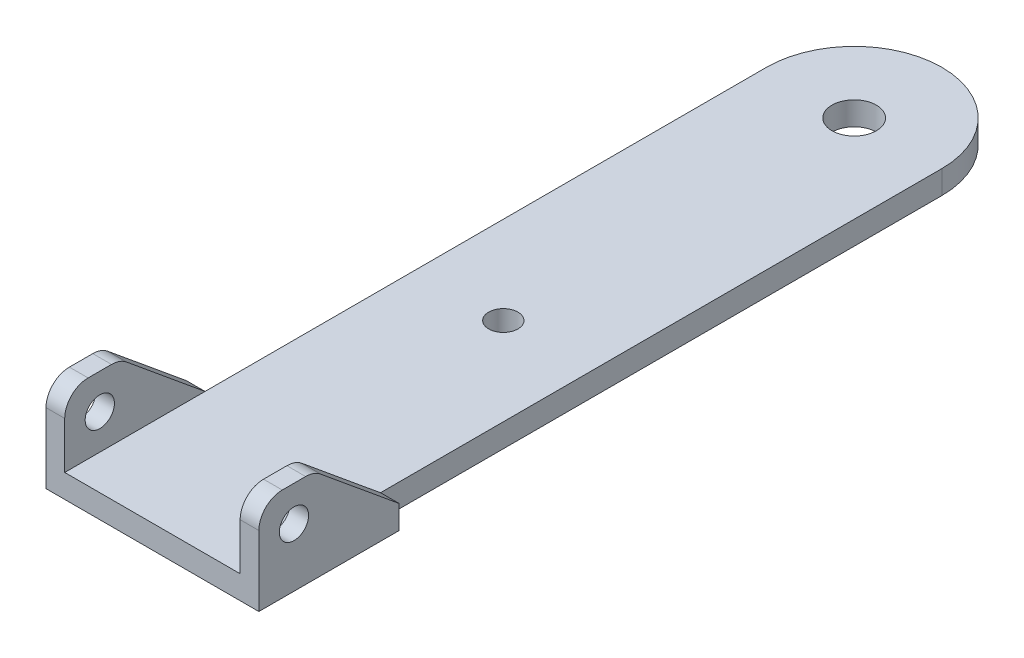
ISO-10303-21;
HEADER;
FILE_DESCRIPTION(('STEP AP214'),'2;1');
FILE_NAME('part.step','',(''),(''),'','','');
FILE_SCHEMA(('AUTOMOTIVE_DESIGN { 1 0 10303 214 1 1 1 1 }'));
ENDSEC;
DATA;
#1=APPLICATION_CONTEXT('core data for automotive mechanical design processes');
#2=APPLICATION_PROTOCOL_DEFINITION('international standard','automotive_design',2000,#1);
#3=PRODUCT_CONTEXT('',#1,'mechanical');
#4=PRODUCT('Part','Part','',(#3));
#5=PRODUCT_RELATED_PRODUCT_CATEGORY('part','',(#4));
#6=PRODUCT_DEFINITION_FORMATION('','',#4);
#7=PRODUCT_DEFINITION_CONTEXT('part definition',#1,'design');
#8=PRODUCT_DEFINITION('design','',#6,#7);
#9=PRODUCT_DEFINITION_SHAPE('','',#8);
#10=(LENGTH_UNIT() NAMED_UNIT(*) SI_UNIT(.MILLI.,.METRE.));
#11=(NAMED_UNIT(*) PLANE_ANGLE_UNIT() SI_UNIT($,.RADIAN.));
#12=(NAMED_UNIT(*) SI_UNIT($,.STERADIAN.) SOLID_ANGLE_UNIT());
#13=UNCERTAINTY_MEASURE_WITH_UNIT(LENGTH_MEASURE(1.E-05),#10,'distance_accuracy_value','');
#14=(GEOMETRIC_REPRESENTATION_CONTEXT(3) GLOBAL_UNCERTAINTY_ASSIGNED_CONTEXT((#13)) GLOBAL_UNIT_ASSIGNED_CONTEXT((#10,
#11,#12)) REPRESENTATION_CONTEXT('',''));
#15=CARTESIAN_POINT('',(0.,0.,0.));
#16=DIRECTION('',(0.,0.,1.));
#17=DIRECTION('',(1.,0.,0.));
#18=AXIS2_PLACEMENT_3D('',#15,#16,#17);
#19=CARTESIAN_POINT('',(37.5,10.,0.));
#20=DIRECTION('',(-1.,0.,0.));
#21=DIRECTION('',(0.,0.,1.));
#22=AXIS2_PLACEMENT_3D('',#19,#20,#21);
#23=PLANE('',#22);
#24=DIRECTION('',(0.,1.,0.));
#25=VECTOR('',#24,1.);
#26=CARTESIAN_POINT('',(37.5,0.,240.));
#27=LINE('',#26,#25);
#28=CARTESIAN_POINT('',(37.5,0.,240.));
#29=VERTEX_POINT('',#28);
#30=CARTESIAN_POINT('',(37.5,10.,240.));
#31=VERTEX_POINT('',#30);
#32=EDGE_CURVE('E53',#29,#31,#27,.T.);
#33=ORIENTED_EDGE('',*,*,#32,.F.);
#34=DIRECTION('',(0.,0.,-1.));
#35=VECTOR('',#34,1.);
#36=CARTESIAN_POINT('',(37.5,0.,0.));
#37=LINE('',#36,#35);
#38=CARTESIAN_POINT('',(37.5,0.,0.));
#39=VERTEX_POINT('',#38);
#40=EDGE_CURVE('E159',#29,#39,#37,.T.);
#41=ORIENTED_EDGE('',*,*,#40,.T.);
#42=DIRECTION('',(0.,-1.,0.));
#43=VECTOR('',#42,1.);
#44=CARTESIAN_POINT('',(37.5,10.,0.));
#45=LINE('',#44,#43);
#46=CARTESIAN_POINT('',(37.5,10.,0.));
#47=VERTEX_POINT('',#46);
#48=EDGE_CURVE('E41',#47,#39,#45,.T.);
#49=ORIENTED_EDGE('',*,*,#48,.F.);
#50=DIRECTION('',(0.,0.,-1.));
#51=VECTOR('',#50,1.);
#52=CARTESIAN_POINT('',(37.5,10.,0.));
#53=LINE('',#52,#51);
#54=EDGE_CURVE('E48',#31,#47,#53,.T.);
#55=ORIENTED_EDGE('',*,*,#54,.F.);
#56=EDGE_LOOP('',(#33,#41,#49,#55));
#57=FACE_BOUND('',#56,.T.);
#58=ADVANCED_FACE('F33',(#57),#23,.F.);
#59=CARTESIAN_POINT('',(0.,10.,0.));
#60=DIRECTION('',(0.,-1.,0.));
#61=DIRECTION('',(0.,0.,-1.));
#62=AXIS2_PLACEMENT_3D('',#59,#60,#61);
#63=PLANE('',#62);
#64=CARTESIAN_POINT('',(0.,10.,0.));
#65=DIRECTION('',(0.,1.,0.));
#66=DIRECTION('',(0.,0.,-1.));
#67=AXIS2_PLACEMENT_3D('',#64,#65,#66);
#68=CIRCLE('',#67,37.5);
#69=CARTESIAN_POINT('',(-37.5,10.,0.));
#70=VERTEX_POINT('',#69);
#71=EDGE_CURVE('E284',#47,#70,#68,.T.);
#72=ORIENTED_EDGE('',*,*,#71,.T.);
#73=DIRECTION('',(0.,0.,1.));
#74=VECTOR('',#73,1.);
#75=CARTESIAN_POINT('',(-37.5,10.,0.));
#76=LINE('',#75,#74);
#77=CARTESIAN_POINT('',(-37.5,10.,240.));
#78=VERTEX_POINT('',#77);
#79=EDGE_CURVE('E287',#70,#78,#76,.T.);
#80=ORIENTED_EDGE('',*,*,#79,.T.);
#81=DIRECTION('',(0.,0.,-1.));
#82=VECTOR('',#81,1.);
#83=CARTESIAN_POINT('',(-37.5,10.,0.));
#84=LINE('',#83,#82);
#85=CARTESIAN_POINT('',(-37.5,10.,300.));
#86=VERTEX_POINT('',#85);
#87=EDGE_CURVE('E220',#86,#78,#84,.T.);
#88=ORIENTED_EDGE('',*,*,#87,.F.);
#89=DIRECTION('',(1.,0.,0.));
#90=VECTOR('',#89,1.);
#91=CARTESIAN_POINT('',(-37.5,10.,300.));
#92=LINE('',#91,#90);
#93=CARTESIAN_POINT('',(37.5,10.,300.));
#94=VERTEX_POINT('',#93);
#95=EDGE_CURVE('E290',#86,#94,#92,.T.);
#96=ORIENTED_EDGE('',*,*,#95,.T.);
#97=EDGE_CURVE('E292',#94,#31,#53,.T.);
#98=ORIENTED_EDGE('',*,*,#97,.T.);
#99=ORIENTED_EDGE('',*,*,#54,.T.);
#100=EDGE_LOOP('',(#72,#80,#88,#96,#98,#99));
#101=FACE_BOUND('',#100,.T.);
#102=CARTESIAN_POINT('',(0.,10.,0.));
#103=DIRECTION('',(0.,1.,0.));
#104=DIRECTION('',(0.,0.,1.));
#105=AXIS2_PLACEMENT_3D('',#102,#103,#104);
#106=CIRCLE('',#105,9.5);
#107=CARTESIAN_POINT('',(0.,10.,9.5));
#108=VERTEX_POINT('',#107);
#109=EDGE_CURVE('E278',#108,#108,#106,.T.);
#110=ORIENTED_EDGE('',*,*,#109,.F.);
#111=EDGE_LOOP('',(#110));
#112=FACE_BOUND('',#111,.T.);
#113=CARTESIAN_POINT('',(0.,10.,150.));
#114=DIRECTION('',(0.,1.,0.));
#115=DIRECTION('',(0.,0.,1.));
#116=AXIS2_PLACEMENT_3D('',#113,#114,#115);
#117=CIRCLE('',#116,6.25);
#118=CARTESIAN_POINT('',(0.,10.,156.25));
#119=VERTEX_POINT('',#118);
#120=EDGE_CURVE('E272',#119,#119,#117,.T.);
#121=ORIENTED_EDGE('',*,*,#120,.F.);
#122=EDGE_LOOP('',(#121));
#123=FACE_BOUND('',#122,.T.);
#124=ADVANCED_FACE('F307',(#101,#112,#123),#63,.F.);
#125=CARTESIAN_POINT('',(0.,0.,0.));
#126=DIRECTION('',(0.,-1.,0.));
#127=DIRECTION('',(0.,0.,-1.));
#128=AXIS2_PLACEMENT_3D('',#125,#126,#127);
#129=PLANE('',#128);
#130=CARTESIAN_POINT('',(0.,0.,0.));
#131=DIRECTION('',(0.,1.,0.));
#132=DIRECTION('',(0.,0.,1.));
#133=AXIS2_PLACEMENT_3D('',#130,#131,#132);
#134=CIRCLE('',#133,9.5);
#135=CARTESIAN_POINT('',(0.,0.,9.5));
#136=VERTEX_POINT('',#135);
#137=EDGE_CURVE('E275',#136,#136,#134,.T.);
#138=ORIENTED_EDGE('',*,*,#137,.T.);
#139=EDGE_LOOP('',(#138));
#140=FACE_BOUND('',#139,.T.);
#141=CARTESIAN_POINT('',(0.,0.,0.));
#142=DIRECTION('',(0.,1.,0.));
#143=DIRECTION('',(0.,0.,-1.));
#144=AXIS2_PLACEMENT_3D('',#141,#142,#143);
#145=CIRCLE('',#144,37.5);
#146=CARTESIAN_POINT('',(-37.5,0.,0.));
#147=VERTEX_POINT('',#146);
#148=EDGE_CURVE('E281',#39,#147,#145,.T.);
#149=ORIENTED_EDGE('',*,*,#148,.F.);
#150=ORIENTED_EDGE('',*,*,#40,.F.);
#151=DIRECTION('',(-1.,0.,0.));
#152=VECTOR('',#151,1.);
#153=CARTESIAN_POINT('',(45.5,0.,240.));
#154=LINE('',#153,#152);
#155=CARTESIAN_POINT('',(45.5,0.,240.));
#156=VERTEX_POINT('',#155);
#157=EDGE_CURVE('E268',#156,#29,#154,.T.);
#158=ORIENTED_EDGE('',*,*,#157,.F.);
#159=DIRECTION('',(0.,0.,-1.));
#160=VECTOR('',#159,1.);
#161=CARTESIAN_POINT('',(45.5,0.,300.));
#162=LINE('',#161,#160);
#163=CARTESIAN_POINT('',(45.5,0.,300.));
#164=VERTEX_POINT('',#163);
#165=EDGE_CURVE('E154',#164,#156,#162,.T.);
#166=ORIENTED_EDGE('',*,*,#165,.F.);
#167=DIRECTION('',(1.,0.,0.));
#168=VECTOR('',#167,1.);
#169=CARTESIAN_POINT('',(-37.5,0.,300.));
#170=LINE('',#169,#168);
#171=CARTESIAN_POINT('',(-45.5,0.,300.));
#172=VERTEX_POINT('',#171);
#173=EDGE_CURVE('E145',#172,#164,#170,.T.);
#174=ORIENTED_EDGE('',*,*,#173,.F.);
#175=DIRECTION('',(0.,0.,-1.));
#176=VECTOR('',#175,1.);
#177=CARTESIAN_POINT('',(-45.5,0.,300.));
#178=LINE('',#177,#176);
#179=CARTESIAN_POINT('',(-45.5,0.,240.));
#180=VERTEX_POINT('',#179);
#181=EDGE_CURVE('E150',#172,#180,#178,.T.);
#182=ORIENTED_EDGE('',*,*,#181,.T.);
#183=DIRECTION('',(1.,0.,0.));
#184=VECTOR('',#183,1.);
#185=CARTESIAN_POINT('',(-45.5,0.,240.));
#186=LINE('',#185,#184);
#187=CARTESIAN_POINT('',(-37.5,0.,240.));
#188=VERTEX_POINT('',#187);
#189=EDGE_CURVE('E191',#180,#188,#186,.T.);
#190=ORIENTED_EDGE('',*,*,#189,.T.);
#191=DIRECTION('',(0.,0.,1.));
#192=VECTOR('',#191,1.);
#193=CARTESIAN_POINT('',(-37.5,0.,0.));
#194=LINE('',#193,#192);
#195=EDGE_CURVE('E160',#147,#188,#194,.T.);
#196=ORIENTED_EDGE('',*,*,#195,.F.);
#197=EDGE_LOOP('',(#149,#150,#158,#166,#174,#182,#190,#196));
#198=FACE_BOUND('',#197,.T.);
#199=CARTESIAN_POINT('',(0.,0.,150.));
#200=DIRECTION('',(0.,1.,0.));
#201=DIRECTION('',(0.,0.,1.));
#202=AXIS2_PLACEMENT_3D('',#199,#200,#201);
#203=CIRCLE('',#202,6.25);
#204=CARTESIAN_POINT('',(0.,0.,156.25));
#205=VERTEX_POINT('',#204);
#206=EDGE_CURVE('E271',#205,#205,#203,.T.);
#207=ORIENTED_EDGE('',*,*,#206,.T.);
#208=EDGE_LOOP('',(#207));
#209=FACE_BOUND('',#208,.T.);
#210=ADVANCED_FACE('F148',(#140,#198,#209),#129,.T.);
#211=CARTESIAN_POINT('',(0.,10.,0.));
#212=DIRECTION('',(0.,-1.,0.));
#213=DIRECTION('',(0.,0.,-1.));
#214=AXIS2_PLACEMENT_3D('',#211,#212,#213);
#215=CYLINDRICAL_SURFACE('',#214,37.5);
#216=ORIENTED_EDGE('',*,*,#148,.T.);
#217=DIRECTION('',(0.,-1.,0.));
#218=VECTOR('',#217,1.);
#219=CARTESIAN_POINT('',(-37.5,10.,0.));
#220=LINE('',#219,#218);
#221=EDGE_CURVE('E11',#70,#147,#220,.T.);
#222=ORIENTED_EDGE('',*,*,#221,.F.);
#223=ORIENTED_EDGE('',*,*,#71,.F.);
#224=ORIENTED_EDGE('',*,*,#48,.T.);
#225=EDGE_LOOP('',(#216,#222,#223,#224));
#226=FACE_BOUND('',#225,.T.);
#227=ADVANCED_FACE('F35',(#226),#215,.T.);
#228=CARTESIAN_POINT('',(-37.5,10.,0.));
#229=DIRECTION('',(1.,0.,0.));
#230=DIRECTION('',(0.,0.,-1.));
#231=AXIS2_PLACEMENT_3D('',#228,#229,#230);
#232=PLANE('',#231);
#233=ORIENTED_EDGE('',*,*,#195,.T.);
#234=DIRECTION('',(0.,1.,0.));
#235=VECTOR('',#234,1.);
#236=CARTESIAN_POINT('',(-37.5,0.,240.));
#237=LINE('',#236,#235);
#238=EDGE_CURVE('E171',#188,#78,#237,.T.);
#239=ORIENTED_EDGE('',*,*,#238,.T.);
#240=ORIENTED_EDGE('',*,*,#79,.F.);
#241=ORIENTED_EDGE('',*,*,#221,.T.);
#242=EDGE_LOOP('',(#233,#239,#240,#241));
#243=FACE_BOUND('',#242,.T.);
#244=ADVANCED_FACE('F304',(#243),#232,.F.);
#245=CARTESIAN_POINT('',(-37.5,10.,300.));
#246=DIRECTION('',(0.,0.,-1.));
#247=DIRECTION('',(-1.,0.,0.));
#248=AXIS2_PLACEMENT_3D('',#245,#246,#247);
#249=PLANE('',#248);
#250=ORIENTED_EDGE('',*,*,#173,.T.);
#251=DIRECTION('',(0.,-1.,0.));
#252=VECTOR('',#251,1.);
#253=CARTESIAN_POINT('',(45.5,29.9999999999999,300.));
#254=LINE('',#253,#252);
#255=CARTESIAN_POINT('',(45.5,29.9999999999999,300.));
#256=VERTEX_POINT('',#255);
#257=EDGE_CURVE('E240',#256,#164,#254,.T.);
#258=ORIENTED_EDGE('',*,*,#257,.F.);
#259=DIRECTION('',(-1.,0.,0.));
#260=VECTOR('',#259,1.);
#261=CARTESIAN_POINT('',(45.5,29.9999999999999,300.));
#262=LINE('',#261,#260);
#263=CARTESIAN_POINT('',(37.5,29.9999999999999,300.));
#264=VERTEX_POINT('',#263);
#265=EDGE_CURVE('E242',#256,#264,#262,.T.);
#266=ORIENTED_EDGE('',*,*,#265,.T.);
#267=DIRECTION('',(0.,-1.,0.));
#268=VECTOR('',#267,1.);
#269=CARTESIAN_POINT('',(37.5,29.9999999999999,300.));
#270=LINE('',#269,#268);
#271=EDGE_CURVE('E230',#264,#94,#270,.T.);
#272=ORIENTED_EDGE('',*,*,#271,.T.);
#273=ORIENTED_EDGE('',*,*,#95,.F.);
#274=DIRECTION('',(0.,-1.,0.));
#275=VECTOR('',#274,1.);
#276=CARTESIAN_POINT('',(-37.5,29.9999999999999,300.));
#277=LINE('',#276,#275);
#278=CARTESIAN_POINT('',(-37.5,29.9999999999999,300.));
#279=VERTEX_POINT('',#278);
#280=EDGE_CURVE('E192',#279,#86,#277,.T.);
#281=ORIENTED_EDGE('',*,*,#280,.F.);
#282=DIRECTION('',(1.,0.,0.));
#283=VECTOR('',#282,1.);
#284=CARTESIAN_POINT('',(-45.5,29.9999999999999,300.));
#285=LINE('',#284,#283);
#286=CARTESIAN_POINT('',(-45.5,29.9999999999999,300.));
#287=VERTEX_POINT('',#286);
#288=EDGE_CURVE('E175',#287,#279,#285,.T.);
#289=ORIENTED_EDGE('',*,*,#288,.F.);
#290=DIRECTION('',(0.,-1.,0.));
#291=VECTOR('',#290,1.);
#292=CARTESIAN_POINT('',(-45.5,29.9999999999999,300.));
#293=LINE('',#292,#291);
#294=EDGE_CURVE('E166',#287,#172,#293,.T.);
#295=ORIENTED_EDGE('',*,*,#294,.T.);
#296=EDGE_LOOP('',(#250,#258,#266,#272,#273,#281,#289,#295));
#297=FACE_BOUND('',#296,.T.);
#298=ADVANCED_FACE('F173',(#297),#249,.F.);
#299=CARTESIAN_POINT('',(0.,10.,0.));
#300=DIRECTION('',(0.,-1.,0.));
#301=DIRECTION('',(0.,0.,-1.));
#302=AXIS2_PLACEMENT_3D('',#299,#300,#301);
#303=CYLINDRICAL_SURFACE('',#302,9.5);
#304=ORIENTED_EDGE('',*,*,#109,.T.);
#305=EDGE_LOOP('',(#304));
#306=FACE_BOUND('',#305,.T.);
#307=ORIENTED_EDGE('',*,*,#137,.F.);
#308=EDGE_LOOP('',(#307));
#309=FACE_BOUND('',#308,.T.);
#310=ADVANCED_FACE('F361',(#306,#309),#303,.F.);
#311=CARTESIAN_POINT('',(0.,10.,150.));
#312=DIRECTION('',(0.,-1.,0.));
#313=DIRECTION('',(0.,0.,-1.));
#314=AXIS2_PLACEMENT_3D('',#311,#312,#313);
#315=CYLINDRICAL_SURFACE('',#314,6.25);
#316=ORIENTED_EDGE('',*,*,#120,.T.);
#317=EDGE_LOOP('',(#316));
#318=FACE_BOUND('',#317,.T.);
#319=ORIENTED_EDGE('',*,*,#206,.F.);
#320=EDGE_LOOP('',(#319));
#321=FACE_BOUND('',#320,.T.);
#322=ADVANCED_FACE('F375',(#318,#321),#315,.F.);
#323=CARTESIAN_POINT('',(37.5,30.,280.));
#324=DIRECTION('',(1.,0.,0.));
#325=DIRECTION('',(0.,0.,-1.));
#326=AXIS2_PLACEMENT_3D('',#323,#324,#325);
#327=PLANE('',#326);
#328=CARTESIAN_POINT('',(37.5,25.,285.));
#329=DIRECTION('',(1.,0.,0.));
#330=DIRECTION('',(0.,0.,-1.));
#331=AXIS2_PLACEMENT_3D('',#328,#329,#330);
#332=CIRCLE('',#331,6.25);
#333=CARTESIAN_POINT('',(37.5,25.,278.75));
#334=VERTEX_POINT('',#333);
#335=EDGE_CURVE('E222',#334,#334,#332,.T.);
#336=ORIENTED_EDGE('',*,*,#335,.T.);
#337=EDGE_LOOP('',(#336));
#338=FACE_BOUND('',#337,.T.);
#339=DIRECTION('',(0.,0.635889894354067,0.771779788708135));
#340=VECTOR('',#339,1.);
#341=CARTESIAN_POINT('',(37.5,10.,240.));
#342=LINE('',#341,#340);
#343=CARTESIAN_POINT('',(37.5,37.7177978870813,273.641101056459));
#344=VERTEX_POINT('',#343);
#345=EDGE_CURVE('E244',#31,#344,#342,.T.);
#346=ORIENTED_EDGE('',*,*,#345,.F.);
#347=ORIENTED_EDGE('',*,*,#97,.F.);
#348=ORIENTED_EDGE('',*,*,#271,.F.);
#349=CARTESIAN_POINT('',(37.5,30.,290.));
#350=DIRECTION('',(1.,0.,0.));
#351=DIRECTION('',(0.,0.,1.));
#352=AXIS2_PLACEMENT_3D('',#349,#350,#351);
#353=CIRCLE('',#352,10.);
#354=CARTESIAN_POINT('',(37.5,40.,290.));
#355=VERTEX_POINT('',#354);
#356=EDGE_CURVE('E250',#355,#264,#353,.T.);
#357=ORIENTED_EDGE('',*,*,#356,.F.);
#358=DIRECTION('',(0.,0.,1.));
#359=VECTOR('',#358,1.);
#360=CARTESIAN_POINT('',(37.5,40.,280.));
#361=LINE('',#360,#359);
#362=CARTESIAN_POINT('',(37.5,40.,280.));
#363=VERTEX_POINT('',#362);
#364=EDGE_CURVE('E248',#363,#355,#361,.T.);
#365=ORIENTED_EDGE('',*,*,#364,.F.);
#366=CARTESIAN_POINT('',(37.5,30.,280.));
#367=DIRECTION('',(1.,0.,0.));
#368=DIRECTION('',(0.,0.,-1.));
#369=AXIS2_PLACEMENT_3D('',#366,#367,#368);
#370=CIRCLE('',#369,9.99999999999998);
#371=EDGE_CURVE('E246',#344,#363,#370,.T.);
#372=ORIENTED_EDGE('',*,*,#371,.F.);
#373=EDGE_LOOP('',(#346,#347,#348,#357,#365,#372));
#374=FACE_BOUND('',#373,.T.);
#375=ADVANCED_FACE('F322',(#338,#374),#327,.F.);
#376=CARTESIAN_POINT('',(45.5,30.,280.));
#377=DIRECTION('',(1.,0.,0.));
#378=DIRECTION('',(0.,0.,-1.));
#379=AXIS2_PLACEMENT_3D('',#376,#377,#378);
#380=PLANE('',#379);
#381=ORIENTED_EDGE('',*,*,#165,.T.);
#382=DIRECTION('',(0.,1.,0.));
#383=VECTOR('',#382,1.);
#384=CARTESIAN_POINT('',(45.5,0.,240.));
#385=LINE('',#384,#383);
#386=CARTESIAN_POINT('',(45.5,10.,240.));
#387=VERTEX_POINT('',#386);
#388=EDGE_CURVE('E229',#156,#387,#385,.T.);
#389=ORIENTED_EDGE('',*,*,#388,.T.);
#390=DIRECTION('',(0.,0.635889894354067,0.771779788708135));
#391=VECTOR('',#390,1.);
#392=CARTESIAN_POINT('',(45.5,10.,240.));
#393=LINE('',#392,#391);
#394=CARTESIAN_POINT('',(45.5,37.7177978870813,273.641101056459));
#395=VERTEX_POINT('',#394);
#396=EDGE_CURVE('E232',#387,#395,#393,.T.);
#397=ORIENTED_EDGE('',*,*,#396,.T.);
#398=CARTESIAN_POINT('',(45.5,30.,280.));
#399=DIRECTION('',(1.,0.,0.));
#400=DIRECTION('',(0.,0.,-1.));
#401=AXIS2_PLACEMENT_3D('',#398,#399,#400);
#402=CIRCLE('',#401,9.99999999999998);
#403=CARTESIAN_POINT('',(45.5,40.,280.));
#404=VERTEX_POINT('',#403);
#405=EDGE_CURVE('E234',#395,#404,#402,.T.);
#406=ORIENTED_EDGE('',*,*,#405,.T.);
#407=DIRECTION('',(0.,0.,1.));
#408=VECTOR('',#407,1.);
#409=CARTESIAN_POINT('',(45.5,40.,280.));
#410=LINE('',#409,#408);
#411=CARTESIAN_POINT('',(45.5,40.,290.));
#412=VERTEX_POINT('',#411);
#413=EDGE_CURVE('E236',#404,#412,#410,.T.);
#414=ORIENTED_EDGE('',*,*,#413,.T.);
#415=CARTESIAN_POINT('',(45.5,30.,290.));
#416=DIRECTION('',(1.,0.,0.));
#417=DIRECTION('',(0.,0.,1.));
#418=AXIS2_PLACEMENT_3D('',#415,#416,#417);
#419=CIRCLE('',#418,10.);
#420=EDGE_CURVE('E238',#412,#256,#419,.T.);
#421=ORIENTED_EDGE('',*,*,#420,.T.);
#422=ORIENTED_EDGE('',*,*,#257,.T.);
#423=EDGE_LOOP('',(#381,#389,#397,#406,#414,#421,#422));
#424=FACE_BOUND('',#423,.T.);
#425=CARTESIAN_POINT('',(45.5,25.,285.));
#426=DIRECTION('',(1.,0.,0.));
#427=DIRECTION('',(0.,0.,-1.));
#428=AXIS2_PLACEMENT_3D('',#425,#426,#427);
#429=CIRCLE('',#428,6.25);
#430=CARTESIAN_POINT('',(45.5,25.,278.75));
#431=VERTEX_POINT('',#430);
#432=EDGE_CURVE('E223',#431,#431,#429,.T.);
#433=ORIENTED_EDGE('',*,*,#432,.F.);
#434=EDGE_LOOP('',(#433));
#435=FACE_BOUND('',#434,.T.);
#436=ADVANCED_FACE('F335',(#424,#435),#380,.T.);
#437=CARTESIAN_POINT('',(45.5,0.,240.));
#438=DIRECTION('',(0.,0.,1.));
#439=DIRECTION('',(1.,0.,0.));
#440=AXIS2_PLACEMENT_3D('',#437,#438,#439);
#441=PLANE('',#440);
#442=ORIENTED_EDGE('',*,*,#32,.T.);
#443=DIRECTION('',(-1.,0.,0.));
#444=VECTOR('',#443,1.);
#445=CARTESIAN_POINT('',(45.5,10.,240.));
#446=LINE('',#445,#444);
#447=EDGE_CURVE('E265',#387,#31,#446,.T.);
#448=ORIENTED_EDGE('',*,*,#447,.F.);
#449=ORIENTED_EDGE('',*,*,#388,.F.);
#450=ORIENTED_EDGE('',*,*,#157,.T.);
#451=EDGE_LOOP('',(#442,#448,#449,#450));
#452=FACE_BOUND('',#451,.T.);
#453=ADVANCED_FACE('F316',(#452),#441,.F.);
#454=CARTESIAN_POINT('',(45.5,10.,240.));
#455=DIRECTION('',(0.,-0.771779788708135,0.635889894354067));
#456=DIRECTION('',(0.,-0.635889894354067,-0.771779788708135));
#457=AXIS2_PLACEMENT_3D('',#454,#455,#456);
#458=PLANE('',#457);
#459=ORIENTED_EDGE('',*,*,#345,.T.);
#460=DIRECTION('',(-1.,0.,0.));
#461=VECTOR('',#460,1.);
#462=CARTESIAN_POINT('',(45.5,37.7177978870813,273.641101056459));
#463=LINE('',#462,#461);
#464=EDGE_CURVE('E262',#395,#344,#463,.T.);
#465=ORIENTED_EDGE('',*,*,#464,.F.);
#466=ORIENTED_EDGE('',*,*,#396,.F.);
#467=ORIENTED_EDGE('',*,*,#447,.T.);
#468=EDGE_LOOP('',(#459,#465,#466,#467));
#469=FACE_BOUND('',#468,.T.);
#470=ADVANCED_FACE('F319',(#469),#458,.F.);
#471=CARTESIAN_POINT('',(45.5,30.,280.));
#472=DIRECTION('',(-1.,0.,0.));
#473=DIRECTION('',(0.,0.,1.));
#474=AXIS2_PLACEMENT_3D('',#471,#472,#473);
#475=CYLINDRICAL_SURFACE('',#474,9.99999999999998);
#476=ORIENTED_EDGE('',*,*,#371,.T.);
#477=DIRECTION('',(-1.,0.,0.));
#478=VECTOR('',#477,1.);
#479=CARTESIAN_POINT('',(45.5,40.,280.));
#480=LINE('',#479,#478);
#481=EDGE_CURVE('E259',#404,#363,#480,.T.);
#482=ORIENTED_EDGE('',*,*,#481,.F.);
#483=ORIENTED_EDGE('',*,*,#405,.F.);
#484=ORIENTED_EDGE('',*,*,#464,.T.);
#485=EDGE_LOOP('',(#476,#482,#483,#484));
#486=FACE_BOUND('',#485,.T.);
#487=ADVANCED_FACE('F327',(#486),#475,.T.);
#488=CARTESIAN_POINT('',(45.5,40.,280.));
#489=DIRECTION('',(0.,-1.,0.));
#490=DIRECTION('',(0.,0.,-1.));
#491=AXIS2_PLACEMENT_3D('',#488,#489,#490);
#492=PLANE('',#491);
#493=ORIENTED_EDGE('',*,*,#364,.T.);
#494=DIRECTION('',(-1.,0.,0.));
#495=VECTOR('',#494,1.);
#496=CARTESIAN_POINT('',(45.5,40.,290.));
#497=LINE('',#496,#495);
#498=EDGE_CURVE('E256',#412,#355,#497,.T.);
#499=ORIENTED_EDGE('',*,*,#498,.F.);
#500=ORIENTED_EDGE('',*,*,#413,.F.);
#501=ORIENTED_EDGE('',*,*,#481,.T.);
#502=EDGE_LOOP('',(#493,#499,#500,#501));
#503=FACE_BOUND('',#502,.T.);
#504=ADVANCED_FACE('F331',(#503),#492,.F.);
#505=CARTESIAN_POINT('',(45.5,30.,290.));
#506=DIRECTION('',(-1.,0.,0.));
#507=DIRECTION('',(0.,0.,1.));
#508=AXIS2_PLACEMENT_3D('',#505,#506,#507);
#509=CYLINDRICAL_SURFACE('',#508,10.);
#510=ORIENTED_EDGE('',*,*,#356,.T.);
#511=ORIENTED_EDGE('',*,*,#265,.F.);
#512=ORIENTED_EDGE('',*,*,#420,.F.);
#513=ORIENTED_EDGE('',*,*,#498,.T.);
#514=EDGE_LOOP('',(#510,#511,#512,#513));
#515=FACE_BOUND('',#514,.T.);
#516=ADVANCED_FACE('F339',(#515),#509,.T.);
#517=CARTESIAN_POINT('',(45.5,25.,285.));
#518=DIRECTION('',(-1.,0.,0.));
#519=DIRECTION('',(0.,0.,1.));
#520=AXIS2_PLACEMENT_3D('',#517,#518,#519);
#521=CYLINDRICAL_SURFACE('',#520,6.25);
#522=ORIENTED_EDGE('',*,*,#432,.T.);
#523=EDGE_LOOP('',(#522));
#524=FACE_BOUND('',#523,.T.);
#525=ORIENTED_EDGE('',*,*,#335,.F.);
#526=EDGE_LOOP('',(#525));
#527=FACE_BOUND('',#526,.T.);
#528=ADVANCED_FACE('F341',(#524,#527),#521,.F.);
#529=CARTESIAN_POINT('',(-37.5,30.,280.));
#530=DIRECTION('',(-1.,0.,0.));
#531=DIRECTION('',(0.,0.,-1.));
#532=AXIS2_PLACEMENT_3D('',#529,#530,#531);
#533=PLANE('',#532);
#534=CARTESIAN_POINT('',(-37.5,25.,285.));
#535=DIRECTION('',(1.,0.,0.));
#536=DIRECTION('',(0.,0.,-1.));
#537=AXIS2_PLACEMENT_3D('',#534,#535,#536);
#538=CIRCLE('',#537,6.25);
#539=CARTESIAN_POINT('',(-37.5,25.,278.75));
#540=VERTEX_POINT('',#539);
#541=EDGE_CURVE('E574',#540,#540,#538,.T.);
#542=ORIENTED_EDGE('',*,*,#541,.F.);
#543=EDGE_LOOP('',(#542));
#544=FACE_BOUND('',#543,.T.);
#545=ORIENTED_EDGE('',*,*,#280,.T.);
#546=ORIENTED_EDGE('',*,*,#87,.T.);
#547=DIRECTION('',(0.,0.635889894354067,0.771779788708135));
#548=VECTOR('',#547,1.);
#549=CARTESIAN_POINT('',(-37.5,10.,240.));
#550=LINE('',#549,#548);
#551=CARTESIAN_POINT('',(-37.5,37.7177978870813,273.641101056459));
#552=VERTEX_POINT('',#551);
#553=EDGE_CURVE('E204',#78,#552,#550,.T.);
#554=ORIENTED_EDGE('',*,*,#553,.T.);
#555=CARTESIAN_POINT('',(-37.5,30.,280.));
#556=DIRECTION('',(1.,0.,0.));
#557=DIRECTION('',(0.,0.,-1.));
#558=AXIS2_PLACEMENT_3D('',#555,#556,#557);
#559=CIRCLE('',#558,9.99999999999998);
#560=CARTESIAN_POINT('',(-37.5,40.,280.));
#561=VERTEX_POINT('',#560);
#562=EDGE_CURVE('E201',#552,#561,#559,.T.);
#563=ORIENTED_EDGE('',*,*,#562,.T.);
#564=DIRECTION('',(0.,0.,1.));
#565=VECTOR('',#564,1.);
#566=CARTESIAN_POINT('',(-37.5,40.,280.));
#567=LINE('',#566,#565);
#568=CARTESIAN_POINT('',(-37.5,40.,290.));
#569=VERTEX_POINT('',#568);
#570=EDGE_CURVE('E198',#561,#569,#567,.T.);
#571=ORIENTED_EDGE('',*,*,#570,.T.);
#572=CARTESIAN_POINT('',(-37.5,30.,290.));
#573=DIRECTION('',(1.,0.,0.));
#574=DIRECTION('',(0.,0.,1.));
#575=AXIS2_PLACEMENT_3D('',#572,#573,#574);
#576=CIRCLE('',#575,10.);
#577=EDGE_CURVE('E194',#569,#279,#576,.T.);
#578=ORIENTED_EDGE('',*,*,#577,.T.);
#579=EDGE_LOOP('',(#545,#546,#554,#563,#571,#578));
#580=FACE_BOUND('',#579,.T.);
#581=ADVANCED_FACE('F347',(#544,#580),#533,.F.);
#582=CARTESIAN_POINT('',(-45.5,30.,290.));
#583=DIRECTION('',(1.,0.,0.));
#584=DIRECTION('',(0.,0.,-1.));
#585=AXIS2_PLACEMENT_3D('',#582,#583,#584);
#586=CYLINDRICAL_SURFACE('',#585,10.);
#587=ORIENTED_EDGE('',*,*,#577,.F.);
#588=DIRECTION('',(1.,0.,0.));
#589=VECTOR('',#588,1.);
#590=CARTESIAN_POINT('',(-45.5,40.,290.));
#591=LINE('',#590,#589);
#592=CARTESIAN_POINT('',(-45.5,40.,290.));
#593=VERTEX_POINT('',#592);
#594=EDGE_CURVE('E217',#593,#569,#591,.T.);
#595=ORIENTED_EDGE('',*,*,#594,.F.);
#596=CARTESIAN_POINT('',(-45.5,30.,290.));
#597=DIRECTION('',(1.,0.,0.));
#598=DIRECTION('',(0.,0.,1.));
#599=AXIS2_PLACEMENT_3D('',#596,#597,#598);
#600=CIRCLE('',#599,10.);
#601=EDGE_CURVE('E176',#593,#287,#600,.T.);
#602=ORIENTED_EDGE('',*,*,#601,.T.);
#603=ORIENTED_EDGE('',*,*,#288,.T.);
#604=EDGE_LOOP('',(#587,#595,#602,#603));
#605=FACE_BOUND('',#604,.T.);
#606=ADVANCED_FACE('F441',(#605),#586,.T.);
#607=CARTESIAN_POINT('',(-45.5,40.,280.));
#608=DIRECTION('',(0.,1.,0.));
#609=DIRECTION('',(0.,0.,1.));
#610=AXIS2_PLACEMENT_3D('',#607,#608,#609);
#611=PLANE('',#610);
#612=ORIENTED_EDGE('',*,*,#570,.F.);
#613=DIRECTION('',(1.,0.,0.));
#614=VECTOR('',#613,1.);
#615=CARTESIAN_POINT('',(-45.5,40.,280.));
#616=LINE('',#615,#614);
#617=CARTESIAN_POINT('',(-45.5,40.,280.));
#618=VERTEX_POINT('',#617);
#619=EDGE_CURVE('E215',#618,#561,#616,.T.);
#620=ORIENTED_EDGE('',*,*,#619,.F.);
#621=DIRECTION('',(0.,0.,1.));
#622=VECTOR('',#621,1.);
#623=CARTESIAN_POINT('',(-45.5,40.,280.));
#624=LINE('',#623,#622);
#625=EDGE_CURVE('E178',#618,#593,#624,.T.);
#626=ORIENTED_EDGE('',*,*,#625,.T.);
#627=ORIENTED_EDGE('',*,*,#594,.T.);
#628=EDGE_LOOP('',(#612,#620,#626,#627));
#629=FACE_BOUND('',#628,.T.);
#630=ADVANCED_FACE('F451',(#629),#611,.T.);
#631=CARTESIAN_POINT('',(-45.5,30.,280.));
#632=DIRECTION('',(1.,0.,0.));
#633=DIRECTION('',(0.,0.,-1.));
#634=AXIS2_PLACEMENT_3D('',#631,#632,#633);
#635=CYLINDRICAL_SURFACE('',#634,9.99999999999998);
#636=ORIENTED_EDGE('',*,*,#562,.F.);
#637=DIRECTION('',(1.,0.,0.));
#638=VECTOR('',#637,1.);
#639=CARTESIAN_POINT('',(-45.5,37.7177978870813,273.641101056459));
#640=LINE('',#639,#638);
#641=CARTESIAN_POINT('',(-45.5,37.7177978870813,273.641101056459));
#642=VERTEX_POINT('',#641);
#643=EDGE_CURVE('E213',#642,#552,#640,.T.);
#644=ORIENTED_EDGE('',*,*,#643,.F.);
#645=CARTESIAN_POINT('',(-45.5,30.,280.));
#646=DIRECTION('',(1.,0.,0.));
#647=DIRECTION('',(0.,0.,-1.));
#648=AXIS2_PLACEMENT_3D('',#645,#646,#647);
#649=CIRCLE('',#648,9.99999999999998);
#650=EDGE_CURVE('E184',#642,#618,#649,.T.);
#651=ORIENTED_EDGE('',*,*,#650,.T.);
#652=ORIENTED_EDGE('',*,*,#619,.T.);
#653=EDGE_LOOP('',(#636,#644,#651,#652));
#654=FACE_BOUND('',#653,.T.);
#655=ADVANCED_FACE('F461',(#654),#635,.T.);
#656=CARTESIAN_POINT('',(-45.5,10.,240.));
#657=DIRECTION('',(0.,0.771779788708135,-0.635889894354067));
#658=DIRECTION('',(0.,0.635889894354067,0.771779788708135));
#659=AXIS2_PLACEMENT_3D('',#656,#657,#658);
#660=PLANE('',#659);
#661=ORIENTED_EDGE('',*,*,#553,.F.);
#662=DIRECTION('',(1.,0.,0.));
#663=VECTOR('',#662,1.);
#664=CARTESIAN_POINT('',(-45.5,10.,240.));
#665=LINE('',#664,#663);
#666=CARTESIAN_POINT('',(-45.5,10.,240.));
#667=VERTEX_POINT('',#666);
#668=EDGE_CURVE('E210',#667,#78,#665,.T.);
#669=ORIENTED_EDGE('',*,*,#668,.F.);
#670=DIRECTION('',(0.,0.635889894354067,0.771779788708135));
#671=VECTOR('',#670,1.);
#672=CARTESIAN_POINT('',(-45.5,10.,240.));
#673=LINE('',#672,#671);
#674=EDGE_CURVE('E187',#667,#642,#673,.T.);
#675=ORIENTED_EDGE('',*,*,#674,.T.);
#676=ORIENTED_EDGE('',*,*,#643,.T.);
#677=EDGE_LOOP('',(#661,#669,#675,#676));
#678=FACE_BOUND('',#677,.T.);
#679=ADVANCED_FACE('F471',(#678),#660,.T.);
#680=CARTESIAN_POINT('',(-45.5,0.,240.));
#681=DIRECTION('',(0.,0.,-1.));
#682=DIRECTION('',(-1.,0.,0.));
#683=AXIS2_PLACEMENT_3D('',#680,#681,#682);
#684=PLANE('',#683);
#685=ORIENTED_EDGE('',*,*,#238,.F.);
#686=ORIENTED_EDGE('',*,*,#189,.F.);
#687=DIRECTION('',(0.,1.,0.));
#688=VECTOR('',#687,1.);
#689=CARTESIAN_POINT('',(-45.5,0.,240.));
#690=LINE('',#689,#688);
#691=EDGE_CURVE('E170',#180,#667,#690,.T.);
#692=ORIENTED_EDGE('',*,*,#691,.T.);
#693=ORIENTED_EDGE('',*,*,#668,.T.);
#694=EDGE_LOOP('',(#685,#686,#692,#693));
#695=FACE_BOUND('',#694,.T.);
#696=ADVANCED_FACE('F481',(#695),#684,.T.);
#697=CARTESIAN_POINT('',(-45.5,30.,280.));
#698=DIRECTION('',(-1.,0.,0.));
#699=DIRECTION('',(0.,0.,-1.));
#700=AXIS2_PLACEMENT_3D('',#697,#698,#699);
#701=PLANE('',#700);
#702=CARTESIAN_POINT('',(-45.5,25.,285.));
#703=DIRECTION('',(1.,0.,0.));
#704=DIRECTION('',(0.,0.,-1.));
#705=AXIS2_PLACEMENT_3D('',#702,#703,#704);
#706=CIRCLE('',#705,6.25);
#707=CARTESIAN_POINT('',(-45.5,25.,278.75));
#708=VERTEX_POINT('',#707);
#709=EDGE_CURVE('E195',#708,#708,#706,.T.);
#710=ORIENTED_EDGE('',*,*,#709,.T.);
#711=EDGE_LOOP('',(#710));
#712=FACE_BOUND('',#711,.T.);
#713=ORIENTED_EDGE('',*,*,#181,.F.);
#714=ORIENTED_EDGE('',*,*,#294,.F.);
#715=ORIENTED_EDGE('',*,*,#601,.F.);
#716=ORIENTED_EDGE('',*,*,#625,.F.);
#717=ORIENTED_EDGE('',*,*,#650,.F.);
#718=ORIENTED_EDGE('',*,*,#674,.F.);
#719=ORIENTED_EDGE('',*,*,#691,.F.);
#720=EDGE_LOOP('',(#713,#714,#715,#716,#717,#718,#719));
#721=FACE_BOUND('',#720,.T.);
#722=ADVANCED_FACE('F164',(#712,#721),#701,.T.);
#723=CARTESIAN_POINT('',(-45.5,25.,285.));
#724=DIRECTION('',(1.,0.,0.));
#725=DIRECTION('',(0.,0.,-1.));
#726=AXIS2_PLACEMENT_3D('',#723,#724,#725);
#727=CYLINDRICAL_SURFACE('',#726,6.25);
#728=ORIENTED_EDGE('',*,*,#709,.F.);
#729=EDGE_LOOP('',(#728));
#730=FACE_BOUND('',#729,.T.);
#731=ORIENTED_EDGE('',*,*,#541,.T.);
#732=EDGE_LOOP('',(#731));
#733=FACE_BOUND('',#732,.T.);
#734=ADVANCED_FACE('F500',(#730,#733),#727,.F.);
#735=CLOSED_SHELL('',(#58,#124,#210,#227,#244,#298,#310,#322,#375,#436,#453,#470,#487,#504,#516,
#528,#581,#606,#630,#655,#679,#696,#722,#734));
#736=MANIFOLD_SOLID_BREP('B2',#735);
#737=ADVANCED_BREP_SHAPE_REPRESENTATION('',(#18,#736),#14);
#738=SHAPE_DEFINITION_REPRESENTATION(#9,#737);
ENDSEC;
END-ISO-10303-21;
